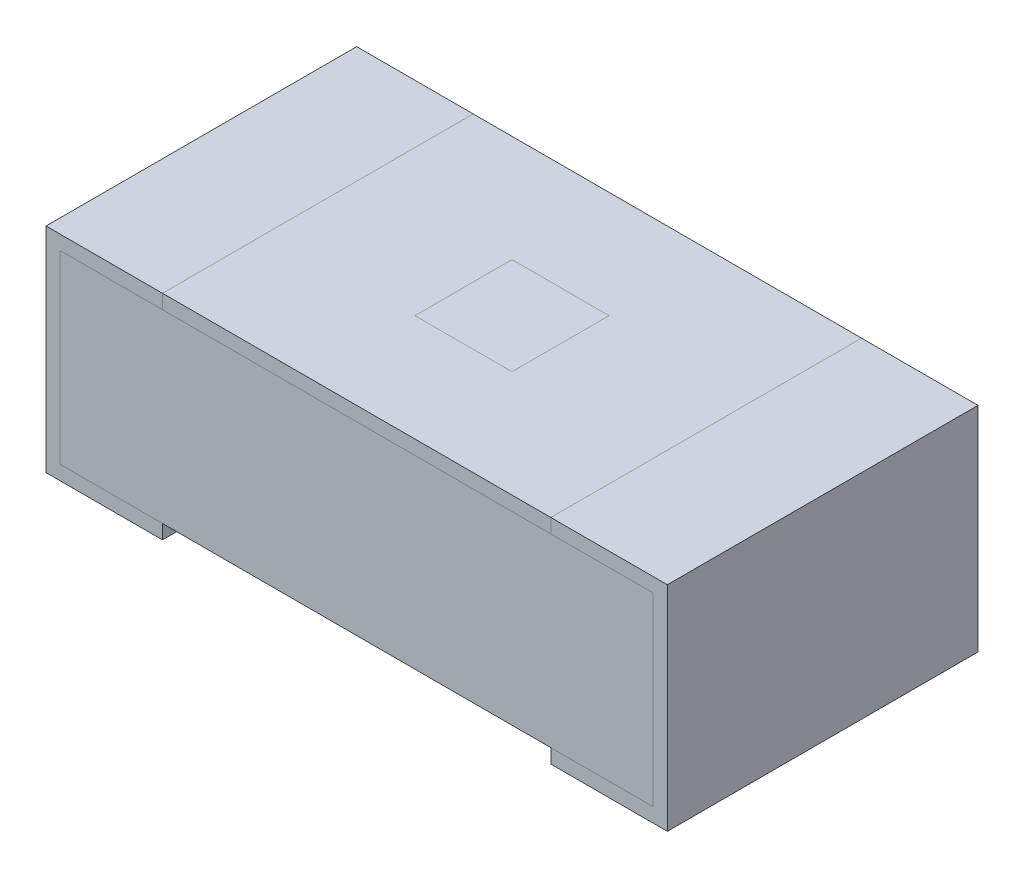
ISO-10303-21;
HEADER;
FILE_DESCRIPTION(('STEP AP214'),'2;1');
FILE_NAME('part.step','',(''),(''),'','','');
FILE_SCHEMA(('AUTOMOTIVE_DESIGN { 1 0 10303 214 1 1 1 1 }'));
ENDSEC;
DATA;
#1=APPLICATION_CONTEXT('core data for automotive mechanical design processes');
#2=APPLICATION_PROTOCOL_DEFINITION('international standard','automotive_design',2000,#1);
#3=PRODUCT_CONTEXT('',#1,'mechanical');
#4=PRODUCT('Part','Part','',(#3));
#5=PRODUCT_RELATED_PRODUCT_CATEGORY('part','',(#4));
#6=PRODUCT_DEFINITION_FORMATION('','',#4);
#7=PRODUCT_DEFINITION_CONTEXT('part definition',#1,'design');
#8=PRODUCT_DEFINITION('design','',#6,#7);
#9=PRODUCT_DEFINITION_SHAPE('','',#8);
#10=(LENGTH_UNIT() NAMED_UNIT(*) SI_UNIT(.MILLI.,.METRE.));
#11=(NAMED_UNIT(*) PLANE_ANGLE_UNIT() SI_UNIT($,.RADIAN.));
#12=(NAMED_UNIT(*) SI_UNIT($,.STERADIAN.) SOLID_ANGLE_UNIT());
#13=UNCERTAINTY_MEASURE_WITH_UNIT(LENGTH_MEASURE(1.E-05),#10,'distance_accuracy_value','');
#14=(GEOMETRIC_REPRESENTATION_CONTEXT(3) GLOBAL_UNCERTAINTY_ASSIGNED_CONTEXT((#13)) GLOBAL_UNIT_ASSIGNED_CONTEXT((#10,
#11,#12)) REPRESENTATION_CONTEXT('',''));
#15=CARTESIAN_POINT('',(0.,0.,0.));
#16=DIRECTION('',(0.,0.,1.));
#17=DIRECTION('',(1.,0.,0.));
#18=AXIS2_PLACEMENT_3D('',#15,#16,#17);
#19=CARTESIAN_POINT('',(-0.8,0.55,0.4));
#20=DIRECTION('',(0.,0.,-1.));
#21=DIRECTION('',(0.,-1.,0.));
#22=AXIS2_PLACEMENT_3D('',#19,#20,#21);
#23=PLANE('',#22);
#24=DIRECTION('',(1.,0.,0.));
#25=VECTOR('',#24,1.);
#26=CARTESIAN_POINT('',(-0.8,0.03666666666667,0.4));
#27=LINE('',#26,#25);
#28=CARTESIAN_POINT('',(-0.763333333333,0.03666666666667,0.4));
#29=VERTEX_POINT('',#28);
#30=CARTESIAN_POINT('',(0.763333333333,0.03666666666667,0.4));
#31=VERTEX_POINT('',#30);
#32=EDGE_CURVE('P0_E99',#29,#31,#27,.T.);
#33=ORIENTED_EDGE('',*,*,#32,.T.);
#34=DIRECTION('',(0.,1.,0.));
#35=VECTOR('',#34,1.);
#36=CARTESIAN_POINT('',(0.763333333333,0.55,0.4));
#37=LINE('',#36,#35);
#38=CARTESIAN_POINT('',(0.763333333333,0.513333333333,0.4));
#39=VERTEX_POINT('',#38);
#40=EDGE_CURVE('P0_E11',#31,#39,#37,.T.);
#41=ORIENTED_EDGE('',*,*,#40,.T.);
#42=DIRECTION('',(-1.,0.,0.));
#43=VECTOR('',#42,1.);
#44=CARTESIAN_POINT('',(-0.8,0.513333333333,0.4));
#45=LINE('',#44,#43);
#46=CARTESIAN_POINT('',(-0.763333333333,0.513333333333,0.4));
#47=VERTEX_POINT('',#46);
#48=EDGE_CURVE('P0_E20',#39,#47,#45,.T.);
#49=ORIENTED_EDGE('',*,*,#48,.T.);
#50=DIRECTION('',(0.,-1.,0.));
#51=VECTOR('',#50,1.);
#52=CARTESIAN_POINT('',(-0.763333333333,0.55,0.4));
#53=LINE('',#52,#51);
#54=EDGE_CURVE('P0_E77',#47,#29,#53,.T.);
#55=ORIENTED_EDGE('',*,*,#54,.T.);
#56=EDGE_LOOP('',(#33,#41,#49,#55));
#57=FACE_BOUND('',#56,.T.);
#58=ADVANCED_FACE('P0_F17',(#57),#23,.F.);
#59=CARTESIAN_POINT('',(-0.8,0.55,-0.4));
#60=DIRECTION('',(0.,0.,1.));
#61=DIRECTION('',(1.,0.,0.));
#62=AXIS2_PLACEMENT_3D('',#59,#60,#61);
#63=PLANE('',#62);
#64=DIRECTION('',(0.,-1.,0.));
#65=VECTOR('',#64,1.);
#66=CARTESIAN_POINT('',(0.763333333333,0.55,-0.4));
#67=LINE('',#66,#65);
#68=CARTESIAN_POINT('',(0.763333333333,0.513333333333,-0.4));
#69=VERTEX_POINT('',#68);
#70=CARTESIAN_POINT('',(0.763333333333,0.03666666666667,-0.4));
#71=VERTEX_POINT('',#70);
#72=EDGE_CURVE('P0_E27',#69,#71,#67,.T.);
#73=ORIENTED_EDGE('',*,*,#72,.T.);
#74=DIRECTION('',(-1.,0.,0.));
#75=VECTOR('',#74,1.);
#76=CARTESIAN_POINT('',(-0.8,0.03666666666667,-0.4));
#77=LINE('',#76,#75);
#78=CARTESIAN_POINT('',(-0.763333333333,0.03666666666667,-0.4));
#79=VERTEX_POINT('',#78);
#80=EDGE_CURVE('P0_E108',#71,#79,#77,.T.);
#81=ORIENTED_EDGE('',*,*,#80,.T.);
#82=DIRECTION('',(0.,1.,0.));
#83=VECTOR('',#82,1.);
#84=CARTESIAN_POINT('',(-0.763333333333,0.55,-0.4));
#85=LINE('',#84,#83);
#86=CARTESIAN_POINT('',(-0.763333333333,0.513333333333,-0.4));
#87=VERTEX_POINT('',#86);
#88=EDGE_CURVE('P0_E85',#79,#87,#85,.T.);
#89=ORIENTED_EDGE('',*,*,#88,.T.);
#90=DIRECTION('',(1.,0.,0.));
#91=VECTOR('',#90,1.);
#92=CARTESIAN_POINT('',(-0.8,0.513333333333,-0.4));
#93=LINE('',#92,#91);
#94=EDGE_CURVE('P0_E83',#87,#69,#93,.T.);
#95=ORIENTED_EDGE('',*,*,#94,.T.);
#96=EDGE_LOOP('',(#73,#81,#89,#95));
#97=FACE_BOUND('',#96,.T.);
#98=ADVANCED_FACE('P0_F87',(#97),#63,.F.);
#99=CARTESIAN_POINT('',(0.763333333333,0.513333333333,0.4));
#100=DIRECTION('',(-1.,0.,0.));
#101=DIRECTION('',(0.,0.,1.));
#102=AXIS2_PLACEMENT_3D('',#99,#100,#101);
#103=PLANE('',#102);
#104=ORIENTED_EDGE('',*,*,#72,.F.);
#105=DIRECTION('',(0.,0.,-1.));
#106=VECTOR('',#105,1.);
#107=CARTESIAN_POINT('',(0.763333333333,0.513333333333,0.4));
#108=LINE('',#107,#106);
#109=EDGE_CURVE('P0_E68',#39,#69,#108,.T.);
#110=ORIENTED_EDGE('',*,*,#109,.F.);
#111=ORIENTED_EDGE('',*,*,#40,.F.);
#112=DIRECTION('',(0.,0.,-1.));
#113=VECTOR('',#112,1.);
#114=CARTESIAN_POINT('',(0.763333333333,0.03666666666667,0.4));
#115=LINE('',#114,#113);
#116=EDGE_CURVE('P0_E71',#31,#71,#115,.T.);
#117=ORIENTED_EDGE('',*,*,#116,.T.);
#118=EDGE_LOOP('',(#104,#110,#111,#117));
#119=FACE_BOUND('',#118,.T.);
#120=ADVANCED_FACE('P0_F67',(#119),#103,.F.);
#121=CARTESIAN_POINT('',(-0.763333333333,0.513333333333,0.4));
#122=DIRECTION('',(1.,0.,0.));
#123=DIRECTION('',(0.,1.,0.));
#124=AXIS2_PLACEMENT_3D('',#121,#122,#123);
#125=PLANE('',#124);
#126=ORIENTED_EDGE('',*,*,#88,.F.);
#127=DIRECTION('',(0.,0.,-1.));
#128=VECTOR('',#127,1.);
#129=CARTESIAN_POINT('',(-0.763333333333,0.03666666666667,0.4));
#130=LINE('',#129,#128);
#131=EDGE_CURVE('P0_E91',#29,#79,#130,.T.);
#132=ORIENTED_EDGE('',*,*,#131,.F.);
#133=ORIENTED_EDGE('',*,*,#54,.F.);
#134=DIRECTION('',(0.,0.,-1.));
#135=VECTOR('',#134,1.);
#136=CARTESIAN_POINT('',(-0.763333333333,0.513333333333,0.4));
#137=LINE('',#136,#135);
#138=EDGE_CURVE('P0_E90',#47,#87,#137,.T.);
#139=ORIENTED_EDGE('',*,*,#138,.T.);
#140=EDGE_LOOP('',(#126,#132,#133,#139));
#141=FACE_BOUND('',#140,.T.);
#142=ADVANCED_FACE('P0_F146',(#141),#125,.F.);
#143=CARTESIAN_POINT('',(0.763333333333,0.513333333333,0.4));
#144=DIRECTION('',(0.,-1.,0.));
#145=DIRECTION('',(0.,0.,-1.));
#146=AXIS2_PLACEMENT_3D('',#143,#144,#145);
#147=PLANE('',#146);
#148=ORIENTED_EDGE('',*,*,#94,.F.);
#149=ORIENTED_EDGE('',*,*,#138,.F.);
#150=ORIENTED_EDGE('',*,*,#48,.F.);
#151=ORIENTED_EDGE('',*,*,#109,.T.);
#152=EDGE_LOOP('',(#148,#149,#150,#151));
#153=FACE_BOUND('',#152,.T.);
#154=ADVANCED_FACE('P0_F81',(#153),#147,.F.);
#155=CARTESIAN_POINT('',(-0.763333333333,0.03666666666667,0.4));
#156=DIRECTION('',(0.,1.,0.));
#157=DIRECTION('',(1.,0.,0.));
#158=AXIS2_PLACEMENT_3D('',#155,#156,#157);
#159=PLANE('',#158);
#160=ORIENTED_EDGE('',*,*,#80,.F.);
#161=ORIENTED_EDGE('',*,*,#116,.F.);
#162=ORIENTED_EDGE('',*,*,#32,.F.);
#163=ORIENTED_EDGE('',*,*,#131,.T.);
#164=EDGE_LOOP('',(#160,#161,#162,#163));
#165=FACE_BOUND('',#164,.T.);
#166=ADVANCED_FACE('P0_F145',(#165),#159,.F.);
#167=CLOSED_SHELL('',(#58,#98,#120,#142,#154,#166));
#168=MANIFOLD_SOLID_BREP('P0_B1',#167);
#169=CARTESIAN_POINT('',(0.8,0.55,0.4));
#170=DIRECTION('',(-1.,0.,0.));
#171=DIRECTION('',(0.,0.,1.));
#172=AXIS2_PLACEMENT_3D('',#169,#170,#171);
#173=PLANE('',#172);
#174=DIRECTION('',(0.,0.,-1.));
#175=VECTOR('',#174,1.);
#176=CARTESIAN_POINT('',(0.8,0.,0.4));
#177=LINE('',#176,#175);
#178=CARTESIAN_POINT('',(0.8,0.,0.4));
#179=VERTEX_POINT('',#178);
#180=CARTESIAN_POINT('',(0.8,0.,-0.4));
#181=VERTEX_POINT('',#180);
#182=EDGE_CURVE('P1_E101',#179,#181,#177,.T.);
#183=ORIENTED_EDGE('',*,*,#182,.T.);
#184=DIRECTION('',(0.,-1.,0.));
#185=VECTOR('',#184,1.);
#186=CARTESIAN_POINT('',(0.8,0.55,-0.4));
#187=LINE('',#186,#185);
#188=CARTESIAN_POINT('',(0.8,0.55,-0.4));
#189=VERTEX_POINT('',#188);
#190=EDGE_CURVE('P1_E11',#189,#181,#187,.T.);
#191=ORIENTED_EDGE('',*,*,#190,.F.);
#192=DIRECTION('',(0.,0.,-1.));
#193=VECTOR('',#192,1.);
#194=CARTESIAN_POINT('',(0.8,0.55,0.4));
#195=LINE('',#194,#193);
#196=CARTESIAN_POINT('',(0.8,0.55,0.4));
#197=VERTEX_POINT('',#196);
#198=EDGE_CURVE('P1_E104',#197,#189,#195,.T.);
#199=ORIENTED_EDGE('',*,*,#198,.F.);
#200=DIRECTION('',(0.,-1.,0.));
#201=VECTOR('',#200,1.);
#202=CARTESIAN_POINT('',(0.8,0.55,0.4));
#203=LINE('',#202,#201);
#204=EDGE_CURVE('P1_E26',#197,#179,#203,.T.);
#205=ORIENTED_EDGE('',*,*,#204,.T.);
#206=EDGE_LOOP('',(#183,#191,#199,#205));
#207=FACE_BOUND('',#206,.T.);
#208=ADVANCED_FACE('P1_F16',(#207),#173,.F.);
#209=CARTESIAN_POINT('',(-0.8,0.55,-0.4));
#210=DIRECTION('',(0.,0.,1.));
#211=DIRECTION('',(1.,0.,0.));
#212=AXIS2_PLACEMENT_3D('',#209,#210,#211);
#213=PLANE('',#212);
#214=DIRECTION('',(1.,0.,0.));
#215=VECTOR('',#214,1.);
#216=CARTESIAN_POINT('',(-0.8,0.513333333333,-0.4));
#217=LINE('',#216,#215);
#218=CARTESIAN_POINT('',(0.5,0.513333333333,-0.4));
#219=VERTEX_POINT('',#218);
#220=CARTESIAN_POINT('',(0.763333333333,0.513333333333,-0.4));
#221=VERTEX_POINT('',#220);
#222=EDGE_CURVE('P1_E141',#219,#221,#217,.T.);
#223=ORIENTED_EDGE('',*,*,#222,.F.);
#224=DIRECTION('',(0.,1.,0.));
#225=VECTOR('',#224,1.);
#226=CARTESIAN_POINT('',(0.5,0.55,-0.4));
#227=LINE('',#226,#225);
#228=CARTESIAN_POINT('',(0.5,0.55,-0.4));
#229=VERTEX_POINT('',#228);
#230=EDGE_CURVE('P1_E138',#219,#229,#227,.T.);
#231=ORIENTED_EDGE('',*,*,#230,.T.);
#232=DIRECTION('',(-1.,0.,0.));
#233=VECTOR('',#232,1.);
#234=CARTESIAN_POINT('',(-0.8,0.55,-0.4));
#235=LINE('',#234,#233);
#236=EDGE_CURVE('P1_E113',#189,#229,#235,.T.);
#237=ORIENTED_EDGE('',*,*,#236,.F.);
#238=ORIENTED_EDGE('',*,*,#190,.T.);
#239=DIRECTION('',(-1.,0.,0.));
#240=VECTOR('',#239,1.);
#241=CARTESIAN_POINT('',(-0.8,0.,-0.4));
#242=LINE('',#241,#240);
#243=CARTESIAN_POINT('',(0.5,0.,-0.4));
#244=VERTEX_POINT('',#243);
#245=EDGE_CURVE('P1_E133',#181,#244,#242,.T.);
#246=ORIENTED_EDGE('',*,*,#245,.T.);
#247=DIRECTION('',(0.,-1.,0.));
#248=VECTOR('',#247,1.);
#249=CARTESIAN_POINT('',(0.5,0.55,-0.4));
#250=LINE('',#249,#248);
#251=CARTESIAN_POINT('',(0.5,0.03666666666667,-0.4));
#252=VERTEX_POINT('',#251);
#253=EDGE_CURVE('P1_E147',#252,#244,#250,.T.);
#254=ORIENTED_EDGE('',*,*,#253,.F.);
#255=DIRECTION('',(-1.,0.,0.));
#256=VECTOR('',#255,1.);
#257=CARTESIAN_POINT('',(-0.8,0.03666666666667,-0.4));
#258=LINE('',#257,#256);
#259=CARTESIAN_POINT('',(0.763333333333,0.03666666666667,-0.4));
#260=VERTEX_POINT('',#259);
#261=EDGE_CURVE('P1_E156',#260,#252,#258,.T.);
#262=ORIENTED_EDGE('',*,*,#261,.F.);
#263=DIRECTION('',(0.,-1.,0.));
#264=VECTOR('',#263,1.);
#265=CARTESIAN_POINT('',(0.763333333333,0.55,-0.4));
#266=LINE('',#265,#264);
#267=EDGE_CURVE('P1_E173',#221,#260,#266,.T.);
#268=ORIENTED_EDGE('',*,*,#267,.F.);
#269=EDGE_LOOP('',(#223,#231,#237,#238,#246,#254,#262,#268));
#270=FACE_BOUND('',#269,.T.);
#271=ADVANCED_FACE('P1_F192',(#270),#213,.F.);
#272=CARTESIAN_POINT('',(-0.8,0.55,0.4));
#273=DIRECTION('',(0.,0.,-1.));
#274=DIRECTION('',(0.,-1.,0.));
#275=AXIS2_PLACEMENT_3D('',#272,#273,#274);
#276=PLANE('',#275);
#277=DIRECTION('',(-1.,0.,0.));
#278=VECTOR('',#277,1.);
#279=CARTESIAN_POINT('',(-0.8,0.513333333333,0.4));
#280=LINE('',#279,#278);
#281=CARTESIAN_POINT('',(0.763333333333,0.513333333333,0.4));
#282=VERTEX_POINT('',#281);
#283=CARTESIAN_POINT('',(0.5,0.513333333333,0.4));
#284=VERTEX_POINT('',#283);
#285=EDGE_CURVE('P1_E119',#282,#284,#280,.T.);
#286=ORIENTED_EDGE('',*,*,#285,.F.);
#287=DIRECTION('',(0.,1.,0.));
#288=VECTOR('',#287,1.);
#289=CARTESIAN_POINT('',(0.763333333333,0.55,0.4));
#290=LINE('',#289,#288);
#291=CARTESIAN_POINT('',(0.763333333333,0.03666666666667,0.4));
#292=VERTEX_POINT('',#291);
#293=EDGE_CURVE('P1_E19',#292,#282,#290,.T.);
#294=ORIENTED_EDGE('',*,*,#293,.F.);
#295=DIRECTION('',(1.,0.,0.));
#296=VECTOR('',#295,1.);
#297=CARTESIAN_POINT('',(-0.8,0.03666666666667,0.4));
#298=LINE('',#297,#296);
#299=CARTESIAN_POINT('',(0.5,0.03666666666667,0.4));
#300=VERTEX_POINT('',#299);
#301=EDGE_CURVE('P1_E125',#300,#292,#298,.T.);
#302=ORIENTED_EDGE('',*,*,#301,.F.);
#303=DIRECTION('',(0.,1.,0.));
#304=VECTOR('',#303,1.);
#305=CARTESIAN_POINT('',(0.5,0.55,0.4));
#306=LINE('',#305,#304);
#307=CARTESIAN_POINT('',(0.5,0.,0.4));
#308=VERTEX_POINT('',#307);
#309=EDGE_CURVE('P1_E146',#308,#300,#306,.T.);
#310=ORIENTED_EDGE('',*,*,#309,.F.);
#311=DIRECTION('',(1.,0.,0.));
#312=VECTOR('',#311,1.);
#313=CARTESIAN_POINT('',(-0.8,0.,0.4));
#314=LINE('',#313,#312);
#315=EDGE_CURVE('P1_E97',#308,#179,#314,.T.);
#316=ORIENTED_EDGE('',*,*,#315,.T.);
#317=ORIENTED_EDGE('',*,*,#204,.F.);
#318=DIRECTION('',(1.,0.,0.));
#319=VECTOR('',#318,1.);
#320=CARTESIAN_POINT('',(-0.8,0.55,0.4));
#321=LINE('',#320,#319);
#322=CARTESIAN_POINT('',(0.5,0.55,0.4));
#323=VERTEX_POINT('',#322);
#324=EDGE_CURVE('P1_E94',#323,#197,#321,.T.);
#325=ORIENTED_EDGE('',*,*,#324,.F.);
#326=DIRECTION('',(0.,-1.,0.));
#327=VECTOR('',#326,1.);
#328=CARTESIAN_POINT('',(0.5,0.55,0.4));
#329=LINE('',#328,#327);
#330=EDGE_CURVE('P1_E123',#323,#284,#329,.T.);
#331=ORIENTED_EDGE('',*,*,#330,.T.);
#332=EDGE_LOOP('',(#286,#294,#302,#310,#316,#317,#325,#331));
#333=FACE_BOUND('',#332,.T.);
#334=ADVANCED_FACE('P1_F91',(#333),#276,.F.);
#335=CARTESIAN_POINT('',(0.,0.,0.));
#336=DIRECTION('',(0.,-1.,0.));
#337=DIRECTION('',(0.,0.,-1.));
#338=AXIS2_PLACEMENT_3D('',#335,#336,#337);
#339=PLANE('',#338);
#340=ORIENTED_EDGE('',*,*,#315,.F.);
#341=DIRECTION('',(0.,0.,-1.));
#342=VECTOR('',#341,1.);
#343=CARTESIAN_POINT('',(0.5,0.,0.));
#344=LINE('',#343,#342);
#345=EDGE_CURVE('P1_E151',#308,#244,#344,.T.);
#346=ORIENTED_EDGE('',*,*,#345,.T.);
#347=ORIENTED_EDGE('',*,*,#245,.F.);
#348=ORIENTED_EDGE('',*,*,#182,.F.);
#349=EDGE_LOOP('',(#340,#346,#347,#348));
#350=FACE_BOUND('',#349,.T.);
#351=ADVANCED_FACE('P1_F211',(#350),#339,.T.);
#352=CARTESIAN_POINT('',(0.,0.55,0.));
#353=DIRECTION('',(0.,-1.,0.));
#354=DIRECTION('',(0.,0.,-1.));
#355=AXIS2_PLACEMENT_3D('',#352,#353,#354);
#356=PLANE('',#355);
#357=ORIENTED_EDGE('',*,*,#236,.T.);
#358=DIRECTION('',(0.,0.,1.));
#359=VECTOR('',#358,1.);
#360=CARTESIAN_POINT('',(0.5,0.55,0.));
#361=LINE('',#360,#359);
#362=EDGE_CURVE('P1_E110',#229,#323,#361,.T.);
#363=ORIENTED_EDGE('',*,*,#362,.T.);
#364=ORIENTED_EDGE('',*,*,#324,.T.);
#365=ORIENTED_EDGE('',*,*,#198,.T.);
#366=EDGE_LOOP('',(#357,#363,#364,#365));
#367=FACE_BOUND('',#366,.T.);
#368=ADVANCED_FACE('P1_F108',(#367),#356,.F.);
#369=CARTESIAN_POINT('',(0.763333333333,0.513333333333,0.4));
#370=DIRECTION('',(0.,-1.,0.));
#371=DIRECTION('',(0.,0.,-1.));
#372=AXIS2_PLACEMENT_3D('',#369,#370,#371);
#373=PLANE('',#372);
#374=DIRECTION('',(0.,0.,1.));
#375=VECTOR('',#374,1.);
#376=CARTESIAN_POINT('',(0.5,0.513333333333,0.4));
#377=LINE('',#376,#375);
#378=EDGE_CURVE('P1_E134',#219,#284,#377,.T.);
#379=ORIENTED_EDGE('',*,*,#378,.F.);
#380=ORIENTED_EDGE('',*,*,#222,.T.);
#381=DIRECTION('',(0.,0.,-1.));
#382=VECTOR('',#381,1.);
#383=CARTESIAN_POINT('',(0.763333333333,0.513333333333,0.4));
#384=LINE('',#383,#382);
#385=EDGE_CURVE('P1_E152',#282,#221,#384,.T.);
#386=ORIENTED_EDGE('',*,*,#385,.F.);
#387=ORIENTED_EDGE('',*,*,#285,.T.);
#388=EDGE_LOOP('',(#379,#380,#386,#387));
#389=FACE_BOUND('',#388,.T.);
#390=ADVANCED_FACE('P1_F189',(#389),#373,.T.);
#391=CARTESIAN_POINT('',(0.5,0.,0.4));
#392=DIRECTION('',(-1.,0.,0.));
#393=DIRECTION('',(0.,0.,1.));
#394=AXIS2_PLACEMENT_3D('',#391,#392,#393);
#395=PLANE('',#394);
#396=ORIENTED_EDGE('',*,*,#253,.T.);
#397=ORIENTED_EDGE('',*,*,#345,.F.);
#398=ORIENTED_EDGE('',*,*,#309,.T.);
#399=DIRECTION('',(0.,0.,1.));
#400=VECTOR('',#399,1.);
#401=CARTESIAN_POINT('',(0.5,0.03666666666667,0.4));
#402=LINE('',#401,#400);
#403=EDGE_CURVE('P1_E130',#252,#300,#402,.T.);
#404=ORIENTED_EDGE('',*,*,#403,.F.);
#405=EDGE_LOOP('',(#396,#397,#398,#404));
#406=FACE_BOUND('',#405,.T.);
#407=ADVANCED_FACE('P1_F198',(#406),#395,.T.);
#408=CARTESIAN_POINT('',(0.763333333333,0.513333333333,0.4));
#409=DIRECTION('',(-1.,0.,0.));
#410=DIRECTION('',(0.,0.,1.));
#411=AXIS2_PLACEMENT_3D('',#408,#409,#410);
#412=PLANE('',#411);
#413=ORIENTED_EDGE('',*,*,#267,.T.);
#414=DIRECTION('',(0.,0.,-1.));
#415=VECTOR('',#414,1.);
#416=CARTESIAN_POINT('',(0.763333333333,0.03666666666667,0.4));
#417=LINE('',#416,#415);
#418=EDGE_CURVE('P1_E129',#292,#260,#417,.T.);
#419=ORIENTED_EDGE('',*,*,#418,.F.);
#420=ORIENTED_EDGE('',*,*,#293,.T.);
#421=ORIENTED_EDGE('',*,*,#385,.T.);
#422=EDGE_LOOP('',(#413,#419,#420,#421));
#423=FACE_BOUND('',#422,.T.);
#424=ADVANCED_FACE('P1_F184',(#423),#412,.T.);
#425=CARTESIAN_POINT('',(-0.763333333333,0.03666666666667,0.4));
#426=DIRECTION('',(0.,1.,0.));
#427=DIRECTION('',(1.,0.,0.));
#428=AXIS2_PLACEMENT_3D('',#425,#426,#427);
#429=PLANE('',#428);
#430=ORIENTED_EDGE('',*,*,#261,.T.);
#431=ORIENTED_EDGE('',*,*,#403,.T.);
#432=ORIENTED_EDGE('',*,*,#301,.T.);
#433=ORIENTED_EDGE('',*,*,#418,.T.);
#434=EDGE_LOOP('',(#430,#431,#432,#433));
#435=FACE_BOUND('',#434,.T.);
#436=ADVANCED_FACE('P1_F196',(#435),#429,.T.);
#437=CARTESIAN_POINT('',(0.5,0.55,0.4));
#438=DIRECTION('',(1.,0.,0.));
#439=DIRECTION('',(0.,1.,0.));
#440=AXIS2_PLACEMENT_3D('',#437,#438,#439);
#441=PLANE('',#440);
#442=ORIENTED_EDGE('',*,*,#230,.F.);
#443=ORIENTED_EDGE('',*,*,#378,.T.);
#444=ORIENTED_EDGE('',*,*,#330,.F.);
#445=ORIENTED_EDGE('',*,*,#362,.F.);
#446=EDGE_LOOP('',(#442,#443,#444,#445));
#447=FACE_BOUND('',#446,.T.);
#448=ADVANCED_FACE('P1_F230',(#447),#441,.F.);
#449=CLOSED_SHELL('',(#208,#271,#334,#351,#368,#390,#407,#424,#436,#448));
#450=MANIFOLD_SOLID_BREP('P1_B1',#449);
#451=CARTESIAN_POINT('',(-0.763333333333,0.03666666666667,0.4));
#452=DIRECTION('',(0.,1.,0.));
#453=DIRECTION('',(1.,0.,0.));
#454=AXIS2_PLACEMENT_3D('',#451,#452,#453);
#455=PLANE('',#454);
#456=DIRECTION('',(0.,0.,1.));
#457=VECTOR('',#456,1.);
#458=CARTESIAN_POINT('',(-0.5,0.03666666666667,0.4));
#459=LINE('',#458,#457);
#460=CARTESIAN_POINT('',(-0.5,0.03666666666667,-0.4));
#461=VERTEX_POINT('',#460);
#462=CARTESIAN_POINT('',(-0.5,0.03666666666667,0.4));
#463=VERTEX_POINT('',#462);
#464=EDGE_CURVE('P2_E139',#461,#463,#459,.T.);
#465=ORIENTED_EDGE('',*,*,#464,.F.);
#466=DIRECTION('',(-1.,0.,0.));
#467=VECTOR('',#466,1.);
#468=CARTESIAN_POINT('',(-0.8,0.03666666666667,-0.4));
#469=LINE('',#468,#467);
#470=CARTESIAN_POINT('',(-0.763333333333,0.03666666666667,-0.4));
#471=VERTEX_POINT('',#470);
#472=EDGE_CURVE('P2_E118',#461,#471,#469,.T.);
#473=ORIENTED_EDGE('',*,*,#472,.T.);
#474=DIRECTION('',(0.,0.,-1.));
#475=VECTOR('',#474,1.);
#476=CARTESIAN_POINT('',(-0.763333333333,0.03666666666667,0.4));
#477=LINE('',#476,#475);
#478=CARTESIAN_POINT('',(-0.763333333333,0.03666666666667,0.4));
#479=VERTEX_POINT('',#478);
#480=EDGE_CURVE('P2_E11',#479,#471,#477,.T.);
#481=ORIENTED_EDGE('',*,*,#480,.F.);
#482=DIRECTION('',(1.,0.,0.));
#483=VECTOR('',#482,1.);
#484=CARTESIAN_POINT('',(-0.8,0.03666666666667,0.4));
#485=LINE('',#484,#483);
#486=EDGE_CURVE('P2_E144',#479,#463,#485,.T.);
#487=ORIENTED_EDGE('',*,*,#486,.T.);
#488=EDGE_LOOP('',(#465,#473,#481,#487));
#489=FACE_BOUND('',#488,.T.);
#490=ADVANCED_FACE('P2_F16',(#489),#455,.T.);
#491=CARTESIAN_POINT('',(-0.763333333333,0.513333333333,0.4));
#492=DIRECTION('',(1.,0.,0.));
#493=DIRECTION('',(0.,1.,0.));
#494=AXIS2_PLACEMENT_3D('',#491,#492,#493);
#495=PLANE('',#494);
#496=DIRECTION('',(0.,1.,0.));
#497=VECTOR('',#496,1.);
#498=CARTESIAN_POINT('',(-0.763333333333,0.55,-0.4));
#499=LINE('',#498,#497);
#500=CARTESIAN_POINT('',(-0.763333333333,0.513333333333,-0.4));
#501=VERTEX_POINT('',#500);
#502=EDGE_CURVE('P2_E125',#471,#501,#499,.T.);
#503=ORIENTED_EDGE('',*,*,#502,.T.);
#504=DIRECTION('',(0.,0.,-1.));
#505=VECTOR('',#504,1.);
#506=CARTESIAN_POINT('',(-0.763333333333,0.513333333333,0.4));
#507=LINE('',#506,#505);
#508=CARTESIAN_POINT('',(-0.763333333333,0.513333333333,0.4));
#509=VERTEX_POINT('',#508);
#510=EDGE_CURVE('P2_E27',#509,#501,#507,.T.);
#511=ORIENTED_EDGE('',*,*,#510,.F.);
#512=DIRECTION('',(0.,-1.,0.));
#513=VECTOR('',#512,1.);
#514=CARTESIAN_POINT('',(-0.763333333333,0.55,0.4));
#515=LINE('',#514,#513);
#516=EDGE_CURVE('P2_E140',#509,#479,#515,.T.);
#517=ORIENTED_EDGE('',*,*,#516,.T.);
#518=ORIENTED_EDGE('',*,*,#480,.T.);
#519=EDGE_LOOP('',(#503,#511,#517,#518));
#520=FACE_BOUND('',#519,.T.);
#521=ADVANCED_FACE('P2_F224',(#520),#495,.T.);
#522=CARTESIAN_POINT('',(0.763333333333,0.513333333333,0.4));
#523=DIRECTION('',(0.,-1.,0.));
#524=DIRECTION('',(0.,0.,-1.));
#525=AXIS2_PLACEMENT_3D('',#522,#523,#524);
#526=PLANE('',#525);
#527=DIRECTION('',(1.,0.,0.));
#528=VECTOR('',#527,1.);
#529=CARTESIAN_POINT('',(-0.8,0.513333333333,-0.4));
#530=LINE('',#529,#528);
#531=CARTESIAN_POINT('',(-0.5,0.513333333333,-0.4));
#532=VERTEX_POINT('',#531);
#533=EDGE_CURVE('P2_E150',#501,#532,#530,.T.);
#534=ORIENTED_EDGE('',*,*,#533,.T.);
#535=DIRECTION('',(0.,0.,1.));
#536=VECTOR('',#535,1.);
#537=CARTESIAN_POINT('',(-0.5,0.513333333333,0.4));
#538=LINE('',#537,#536);
#539=CARTESIAN_POINT('',(-0.5,0.513333333333,0.4));
#540=VERTEX_POINT('',#539);
#541=EDGE_CURVE('P2_E147',#532,#540,#538,.T.);
#542=ORIENTED_EDGE('',*,*,#541,.T.);
#543=DIRECTION('',(-1.,0.,0.));
#544=VECTOR('',#543,1.);
#545=CARTESIAN_POINT('',(-0.8,0.513333333333,0.4));
#546=LINE('',#545,#544);
#547=EDGE_CURVE('P2_E143',#540,#509,#546,.T.);
#548=ORIENTED_EDGE('',*,*,#547,.T.);
#549=ORIENTED_EDGE('',*,*,#510,.T.);
#550=EDGE_LOOP('',(#534,#542,#548,#549));
#551=FACE_BOUND('',#550,.T.);
#552=ADVANCED_FACE('P2_F236',(#551),#526,.T.);
#553=CARTESIAN_POINT('',(-0.5,0.55,0.4));
#554=DIRECTION('',(1.,0.,0.));
#555=DIRECTION('',(0.,1.,0.));
#556=AXIS2_PLACEMENT_3D('',#553,#554,#555);
#557=PLANE('',#556);
#558=DIRECTION('',(0.,1.,0.));
#559=VECTOR('',#558,1.);
#560=CARTESIAN_POINT('',(-0.5,0.55,-0.4));
#561=LINE('',#560,#559);
#562=CARTESIAN_POINT('',(-0.5,0.55,-0.4));
#563=VERTEX_POINT('',#562);
#564=EDGE_CURVE('P2_E20',#532,#563,#561,.T.);
#565=ORIENTED_EDGE('',*,*,#564,.T.);
#566=DIRECTION('',(0.,0.,1.));
#567=VECTOR('',#566,1.);
#568=CARTESIAN_POINT('',(-0.5,0.55,0.));
#569=LINE('',#568,#567);
#570=CARTESIAN_POINT('',(-0.5,0.55,0.4));
#571=VERTEX_POINT('',#570);
#572=EDGE_CURVE('P2_E174',#563,#571,#569,.T.);
#573=ORIENTED_EDGE('',*,*,#572,.T.);
#574=DIRECTION('',(0.,-1.,0.));
#575=VECTOR('',#574,1.);
#576=CARTESIAN_POINT('',(-0.5,0.55,0.4));
#577=LINE('',#576,#575);
#578=EDGE_CURVE('P2_E129',#571,#540,#577,.T.);
#579=ORIENTED_EDGE('',*,*,#578,.T.);
#580=ORIENTED_EDGE('',*,*,#541,.F.);
#581=EDGE_LOOP('',(#565,#573,#579,#580));
#582=FACE_BOUND('',#581,.T.);
#583=ADVANCED_FACE('P2_F230',(#582),#557,.T.);
#584=CARTESIAN_POINT('',(0.,0.55,0.));
#585=DIRECTION('',(0.,-1.,0.));
#586=DIRECTION('',(0.,0.,-1.));
#587=AXIS2_PLACEMENT_3D('',#584,#585,#586);
#588=PLANE('',#587);
#589=ORIENTED_EDGE('',*,*,#572,.F.);
#590=DIRECTION('',(-1.,0.,0.));
#591=VECTOR('',#590,1.);
#592=CARTESIAN_POINT('',(-0.8,0.55,-0.4));
#593=LINE('',#592,#591);
#594=CARTESIAN_POINT('',(-0.8,0.55,-0.4));
#595=VERTEX_POINT('',#594);
#596=EDGE_CURVE('P2_E102',#563,#595,#593,.T.);
#597=ORIENTED_EDGE('',*,*,#596,.T.);
#598=DIRECTION('',(0.,0.,1.));
#599=VECTOR('',#598,1.);
#600=CARTESIAN_POINT('',(-0.8,0.55,0.4));
#601=LINE('',#600,#599);
#602=CARTESIAN_POINT('',(-0.8,0.55,0.4));
#603=VERTEX_POINT('',#602);
#604=EDGE_CURVE('P2_E107',#595,#603,#601,.T.);
#605=ORIENTED_EDGE('',*,*,#604,.T.);
#606=DIRECTION('',(1.,0.,0.));
#607=VECTOR('',#606,1.);
#608=CARTESIAN_POINT('',(-0.8,0.55,0.4));
#609=LINE('',#608,#607);
#610=EDGE_CURVE('P2_E133',#603,#571,#609,.T.);
#611=ORIENTED_EDGE('',*,*,#610,.T.);
#612=EDGE_LOOP('',(#589,#597,#605,#611));
#613=FACE_BOUND('',#612,.T.);
#614=ADVANCED_FACE('P2_F235',(#613),#588,.F.);
#615=CARTESIAN_POINT('',(0.,0.,0.));
#616=DIRECTION('',(0.,-1.,0.));
#617=DIRECTION('',(0.,0.,-1.));
#618=AXIS2_PLACEMENT_3D('',#615,#616,#617);
#619=PLANE('',#618);
#620=DIRECTION('',(0.,0.,-1.));
#621=VECTOR('',#620,1.);
#622=CARTESIAN_POINT('',(-0.5,0.,0.));
#623=LINE('',#622,#621);
#624=CARTESIAN_POINT('',(-0.5,0.,0.4));
#625=VERTEX_POINT('',#624);
#626=CARTESIAN_POINT('',(-0.5,0.,-0.4));
#627=VERTEX_POINT('',#626);
#628=EDGE_CURVE('P2_E138',#625,#627,#623,.T.);
#629=ORIENTED_EDGE('',*,*,#628,.F.);
#630=DIRECTION('',(1.,0.,0.));
#631=VECTOR('',#630,1.);
#632=CARTESIAN_POINT('',(-0.8,0.,0.4));
#633=LINE('',#632,#631);
#634=CARTESIAN_POINT('',(-0.8,0.,0.4));
#635=VERTEX_POINT('',#634);
#636=EDGE_CURVE('P2_E96',#635,#625,#633,.T.);
#637=ORIENTED_EDGE('',*,*,#636,.F.);
#638=DIRECTION('',(0.,0.,1.));
#639=VECTOR('',#638,1.);
#640=CARTESIAN_POINT('',(-0.8,0.,0.4));
#641=LINE('',#640,#639);
#642=CARTESIAN_POINT('',(-0.8,0.,-0.4));
#643=VERTEX_POINT('',#642);
#644=EDGE_CURVE('P2_E89',#643,#635,#641,.T.);
#645=ORIENTED_EDGE('',*,*,#644,.F.);
#646=DIRECTION('',(-1.,0.,0.));
#647=VECTOR('',#646,1.);
#648=CARTESIAN_POINT('',(-0.8,0.,-0.4));
#649=LINE('',#648,#647);
#650=EDGE_CURVE('P2_E94',#627,#643,#649,.T.);
#651=ORIENTED_EDGE('',*,*,#650,.F.);
#652=EDGE_LOOP('',(#629,#637,#645,#651));
#653=FACE_BOUND('',#652,.T.);
#654=ADVANCED_FACE('P2_F92',(#653),#619,.T.);
#655=CARTESIAN_POINT('',(-0.8,0.55,0.4));
#656=DIRECTION('',(0.,0.,-1.));
#657=DIRECTION('',(0.,-1.,0.));
#658=AXIS2_PLACEMENT_3D('',#655,#656,#657);
#659=PLANE('',#658);
#660=ORIENTED_EDGE('',*,*,#578,.F.);
#661=ORIENTED_EDGE('',*,*,#610,.F.);
#662=DIRECTION('',(0.,-1.,0.));
#663=VECTOR('',#662,1.);
#664=CARTESIAN_POINT('',(-0.8,0.55,0.4));
#665=LINE('',#664,#663);
#666=EDGE_CURVE('P2_E101',#603,#635,#665,.T.);
#667=ORIENTED_EDGE('',*,*,#666,.T.);
#668=ORIENTED_EDGE('',*,*,#636,.T.);
#669=DIRECTION('',(0.,1.,0.));
#670=VECTOR('',#669,1.);
#671=CARTESIAN_POINT('',(-0.5,0.55,0.4));
#672=LINE('',#671,#670);
#673=EDGE_CURVE('P2_E134',#625,#463,#672,.T.);
#674=ORIENTED_EDGE('',*,*,#673,.T.);
#675=ORIENTED_EDGE('',*,*,#486,.F.);
#676=ORIENTED_EDGE('',*,*,#516,.F.);
#677=ORIENTED_EDGE('',*,*,#547,.F.);
#678=EDGE_LOOP('',(#660,#661,#667,#668,#674,#675,#676,#677));
#679=FACE_BOUND('',#678,.T.);
#680=ADVANCED_FACE('P2_F191',(#679),#659,.F.);
#681=CARTESIAN_POINT('',(-0.8,0.55,0.4));
#682=DIRECTION('',(1.,0.,0.));
#683=DIRECTION('',(0.,1.,0.));
#684=AXIS2_PLACEMENT_3D('',#681,#682,#683);
#685=PLANE('',#684);
#686=ORIENTED_EDGE('',*,*,#644,.T.);
#687=ORIENTED_EDGE('',*,*,#666,.F.);
#688=ORIENTED_EDGE('',*,*,#604,.F.);
#689=DIRECTION('',(0.,-1.,0.));
#690=VECTOR('',#689,1.);
#691=CARTESIAN_POINT('',(-0.8,0.55,-0.4));
#692=LINE('',#691,#690);
#693=EDGE_CURVE('P2_E105',#595,#643,#692,.T.);
#694=ORIENTED_EDGE('',*,*,#693,.T.);
#695=EDGE_LOOP('',(#686,#687,#688,#694));
#696=FACE_BOUND('',#695,.T.);
#697=ADVANCED_FACE('P2_F18',(#696),#685,.F.);
#698=CARTESIAN_POINT('',(-0.8,0.55,-0.4));
#699=DIRECTION('',(0.,0.,1.));
#700=DIRECTION('',(1.,0.,0.));
#701=AXIS2_PLACEMENT_3D('',#698,#699,#700);
#702=PLANE('',#701);
#703=ORIENTED_EDGE('',*,*,#564,.F.);
#704=ORIENTED_EDGE('',*,*,#533,.F.);
#705=ORIENTED_EDGE('',*,*,#502,.F.);
#706=ORIENTED_EDGE('',*,*,#472,.F.);
#707=DIRECTION('',(0.,-1.,0.));
#708=VECTOR('',#707,1.);
#709=CARTESIAN_POINT('',(-0.5,0.55,-0.4));
#710=LINE('',#709,#708);
#711=EDGE_CURVE('P2_E116',#461,#627,#710,.T.);
#712=ORIENTED_EDGE('',*,*,#711,.T.);
#713=ORIENTED_EDGE('',*,*,#650,.T.);
#714=ORIENTED_EDGE('',*,*,#693,.F.);
#715=ORIENTED_EDGE('',*,*,#596,.F.);
#716=EDGE_LOOP('',(#703,#704,#705,#706,#712,#713,#714,#715));
#717=FACE_BOUND('',#716,.T.);
#718=ADVANCED_FACE('P2_F114',(#717),#702,.F.);
#719=CARTESIAN_POINT('',(-0.5,0.,0.4));
#720=DIRECTION('',(-1.,0.,0.));
#721=DIRECTION('',(0.,0.,1.));
#722=AXIS2_PLACEMENT_3D('',#719,#720,#721);
#723=PLANE('',#722);
#724=ORIENTED_EDGE('',*,*,#711,.F.);
#725=ORIENTED_EDGE('',*,*,#464,.T.);
#726=ORIENTED_EDGE('',*,*,#673,.F.);
#727=ORIENTED_EDGE('',*,*,#628,.T.);
#728=EDGE_LOOP('',(#724,#725,#726,#727));
#729=FACE_BOUND('',#728,.T.);
#730=ADVANCED_FACE('P2_F216',(#729),#723,.F.);
#731=CLOSED_SHELL('',(#490,#521,#552,#583,#614,#654,#680,#697,#718,#730));
#732=MANIFOLD_SOLID_BREP('P2_B1',#731);
#733=CARTESIAN_POINT('',(0.125,0.15977994274,0.125));
#734=DIRECTION('',(1.,0.,0.));
#735=DIRECTION('',(0.,1.,0.));
#736=AXIS2_PLACEMENT_3D('',#733,#734,#735);
#737=PLANE('',#736);
#738=DIRECTION('',(0.,1.,0.));
#739=VECTOR('',#738,1.);
#740=CARTESIAN_POINT('',(0.125,0.15977994274,0.125));
#741=LINE('',#740,#739);
#742=CARTESIAN_POINT('',(0.125,0.513333333333,0.125));
#743=VERTEX_POINT('',#742);
#744=CARTESIAN_POINT('',(0.125,0.55,0.125));
#745=VERTEX_POINT('',#744);
#746=EDGE_CURVE('P3_E11',#743,#745,#741,.T.);
#747=ORIENTED_EDGE('',*,*,#746,.T.);
#748=DIRECTION('',(0.,0.,-1.));
#749=VECTOR('',#748,1.);
#750=CARTESIAN_POINT('',(0.125,0.55,0.125));
#751=LINE('',#750,#749);
#752=CARTESIAN_POINT('',(0.125,0.55,-0.125));
#753=VERTEX_POINT('',#752);
#754=EDGE_CURVE('P3_E150',#745,#753,#751,.T.);
#755=ORIENTED_EDGE('',*,*,#754,.T.);
#756=DIRECTION('',(0.,1.,0.));
#757=VECTOR('',#756,1.);
#758=CARTESIAN_POINT('',(0.125,0.15977994274,-0.125));
#759=LINE('',#758,#757);
#760=CARTESIAN_POINT('',(0.125,0.513333333333,-0.125));
#761=VERTEX_POINT('',#760);
#762=EDGE_CURVE('P3_E143',#761,#753,#759,.T.);
#763=ORIENTED_EDGE('',*,*,#762,.F.);
#764=DIRECTION('',(0.,0.,-1.));
#765=VECTOR('',#764,1.);
#766=CARTESIAN_POINT('',(0.125,0.513333333333,0.125));
#767=LINE('',#766,#765);
#768=EDGE_CURVE('P3_E138',#743,#761,#767,.T.);
#769=ORIENTED_EDGE('',*,*,#768,.F.);
#770=EDGE_LOOP('',(#747,#755,#763,#769));
#771=FACE_BOUND('',#770,.T.);
#772=ADVANCED_FACE('P3_F17',(#771),#737,.F.);
#773=CARTESIAN_POINT('',(-0.125,0.15977994274,0.125));
#774=DIRECTION('',(0.,0.,1.));
#775=DIRECTION('',(1.,0.,0.));
#776=AXIS2_PLACEMENT_3D('',#773,#774,#775);
#777=PLANE('',#776);
#778=DIRECTION('',(0.,1.,0.));
#779=VECTOR('',#778,1.);
#780=CARTESIAN_POINT('',(-0.125,0.15977994274,0.125));
#781=LINE('',#780,#779);
#782=CARTESIAN_POINT('',(-0.125,0.513333333333,0.125));
#783=VERTEX_POINT('',#782);
#784=CARTESIAN_POINT('',(-0.125,0.55,0.125));
#785=VERTEX_POINT('',#784);
#786=EDGE_CURVE('P3_E28',#783,#785,#781,.T.);
#787=ORIENTED_EDGE('',*,*,#786,.T.);
#788=DIRECTION('',(1.,0.,0.));
#789=VECTOR('',#788,1.);
#790=CARTESIAN_POINT('',(-0.125,0.55,0.125));
#791=LINE('',#790,#789);
#792=EDGE_CURVE('P3_E111',#785,#745,#791,.T.);
#793=ORIENTED_EDGE('',*,*,#792,.T.);
#794=ORIENTED_EDGE('',*,*,#746,.F.);
#795=DIRECTION('',(1.,0.,0.));
#796=VECTOR('',#795,1.);
#797=CARTESIAN_POINT('',(-0.125,0.513333333333,0.125));
#798=LINE('',#797,#796);
#799=EDGE_CURVE('P3_E142',#783,#743,#798,.T.);
#800=ORIENTED_EDGE('',*,*,#799,.F.);
#801=EDGE_LOOP('',(#787,#793,#794,#800));
#802=FACE_BOUND('',#801,.T.);
#803=ADVANCED_FACE('P3_F339',(#802),#777,.F.);
#804=CARTESIAN_POINT('',(-0.125,0.15977994274,0.125));
#805=DIRECTION('',(-1.,0.,0.));
#806=DIRECTION('',(0.,0.,1.));
#807=AXIS2_PLACEMENT_3D('',#804,#805,#806);
#808=PLANE('',#807);
#809=DIRECTION('',(0.,1.,0.));
#810=VECTOR('',#809,1.);
#811=CARTESIAN_POINT('',(-0.125,0.15977994274,-0.125));
#812=LINE('',#811,#810);
#813=CARTESIAN_POINT('',(-0.125,0.513333333333,-0.125));
#814=VERTEX_POINT('',#813);
#815=CARTESIAN_POINT('',(-0.125,0.55,-0.125));
#816=VERTEX_POINT('',#815);
#817=EDGE_CURVE('P3_E145',#814,#816,#812,.T.);
#818=ORIENTED_EDGE('',*,*,#817,.T.);
#819=DIRECTION('',(0.,0.,1.));
#820=VECTOR('',#819,1.);
#821=CARTESIAN_POINT('',(-0.125,0.55,0.125));
#822=LINE('',#821,#820);
#823=EDGE_CURVE('P3_E165',#816,#785,#822,.T.);
#824=ORIENTED_EDGE('',*,*,#823,.T.);
#825=ORIENTED_EDGE('',*,*,#786,.F.);
#826=DIRECTION('',(0.,0.,1.));
#827=VECTOR('',#826,1.);
#828=CARTESIAN_POINT('',(-0.125,0.513333333333,0.125));
#829=LINE('',#828,#827);
#830=EDGE_CURVE('P3_E169',#814,#783,#829,.T.);
#831=ORIENTED_EDGE('',*,*,#830,.F.);
#832=EDGE_LOOP('',(#818,#824,#825,#831));
#833=FACE_BOUND('',#832,.T.);
#834=ADVANCED_FACE('P3_F329',(#833),#808,.F.);
#835=CARTESIAN_POINT('',(-0.125,0.15977994274,-0.125));
#836=DIRECTION('',(0.,0.,-1.));
#837=DIRECTION('',(0.,-1.,0.));
#838=AXIS2_PLACEMENT_3D('',#835,#836,#837);
#839=PLANE('',#838);
#840=ORIENTED_EDGE('',*,*,#762,.T.);
#841=DIRECTION('',(-1.,0.,0.));
#842=VECTOR('',#841,1.);
#843=CARTESIAN_POINT('',(-0.125,0.55,-0.125));
#844=LINE('',#843,#842);
#845=EDGE_CURVE('P3_E153',#753,#816,#844,.T.);
#846=ORIENTED_EDGE('',*,*,#845,.T.);
#847=ORIENTED_EDGE('',*,*,#817,.F.);
#848=DIRECTION('',(-1.,0.,0.));
#849=VECTOR('',#848,1.);
#850=CARTESIAN_POINT('',(-0.125,0.513333333333,-0.125));
#851=LINE('',#850,#849);
#852=EDGE_CURVE('P3_E121',#761,#814,#851,.T.);
#853=ORIENTED_EDGE('',*,*,#852,.F.);
#854=EDGE_LOOP('',(#840,#846,#847,#853));
#855=FACE_BOUND('',#854,.T.);
#856=ADVANCED_FACE('P3_F320',(#855),#839,.F.);
#857=CARTESIAN_POINT('',(-0.8,0.55,0.4));
#858=DIRECTION('',(0.,0.,-1.));
#859=DIRECTION('',(0.,-1.,0.));
#860=AXIS2_PLACEMENT_3D('',#857,#858,#859);
#861=PLANE('',#860);
#862=DIRECTION('',(0.,-1.,0.));
#863=VECTOR('',#862,1.);
#864=CARTESIAN_POINT('',(0.5,0.55,0.4));
#865=LINE('',#864,#863);
#866=CARTESIAN_POINT('',(0.5,0.55,0.4));
#867=VERTEX_POINT('',#866);
#868=CARTESIAN_POINT('',(0.5,0.513333333333,0.4));
#869=VERTEX_POINT('',#868);
#870=EDGE_CURVE('P3_E162',#867,#869,#865,.T.);
#871=ORIENTED_EDGE('',*,*,#870,.F.);
#872=DIRECTION('',(1.,0.,0.));
#873=VECTOR('',#872,1.);
#874=CARTESIAN_POINT('',(-0.8,0.55,0.4));
#875=LINE('',#874,#873);
#876=CARTESIAN_POINT('',(-0.5,0.55,0.4));
#877=VERTEX_POINT('',#876);
#878=EDGE_CURVE('P3_E110',#877,#867,#875,.T.);
#879=ORIENTED_EDGE('',*,*,#878,.F.);
#880=DIRECTION('',(0.,-1.,0.));
#881=VECTOR('',#880,1.);
#882=CARTESIAN_POINT('',(-0.5,0.55,0.4));
#883=LINE('',#882,#881);
#884=CARTESIAN_POINT('',(-0.5,0.513333333333,0.4));
#885=VERTEX_POINT('',#884);
#886=EDGE_CURVE('P3_E119',#877,#885,#883,.T.);
#887=ORIENTED_EDGE('',*,*,#886,.T.);
#888=DIRECTION('',(-1.,0.,0.));
#889=VECTOR('',#888,1.);
#890=CARTESIAN_POINT('',(-0.8,0.513333333333,0.4));
#891=LINE('',#890,#889);
#892=EDGE_CURVE('P3_E161',#869,#885,#891,.T.);
#893=ORIENTED_EDGE('',*,*,#892,.F.);
#894=EDGE_LOOP('',(#871,#879,#887,#893));
#895=FACE_BOUND('',#894,.T.);
#896=ADVANCED_FACE('P3_F184',(#895),#861,.F.);
#897=CARTESIAN_POINT('',(-0.8,0.55,-0.4));
#898=DIRECTION('',(0.,0.,1.));
#899=DIRECTION('',(1.,0.,0.));
#900=AXIS2_PLACEMENT_3D('',#897,#898,#899);
#901=PLANE('',#900);
#902=DIRECTION('',(0.,1.,0.));
#903=VECTOR('',#902,1.);
#904=CARTESIAN_POINT('',(0.5,0.55,-0.4));
#905=LINE('',#904,#903);
#906=CARTESIAN_POINT('',(0.5,0.513333333333,-0.4));
#907=VERTEX_POINT('',#906);
#908=CARTESIAN_POINT('',(0.5,0.55,-0.4));
#909=VERTEX_POINT('',#908);
#910=EDGE_CURVE('P3_E137',#907,#909,#905,.T.);
#911=ORIENTED_EDGE('',*,*,#910,.F.);
#912=DIRECTION('',(1.,0.,0.));
#913=VECTOR('',#912,1.);
#914=CARTESIAN_POINT('',(-0.8,0.513333333333,-0.4));
#915=LINE('',#914,#913);
#916=CARTESIAN_POINT('',(-0.5,0.513333333333,-0.4));
#917=VERTEX_POINT('',#916);
#918=EDGE_CURVE('P3_E125',#917,#907,#915,.T.);
#919=ORIENTED_EDGE('',*,*,#918,.F.);
#920=DIRECTION('',(0.,1.,0.));
#921=VECTOR('',#920,1.);
#922=CARTESIAN_POINT('',(-0.5,0.55,-0.4));
#923=LINE('',#922,#921);
#924=CARTESIAN_POINT('',(-0.5,0.55,-0.4));
#925=VERTEX_POINT('',#924);
#926=EDGE_CURVE('P3_E117',#917,#925,#923,.T.);
#927=ORIENTED_EDGE('',*,*,#926,.T.);
#928=DIRECTION('',(-1.,0.,0.));
#929=VECTOR('',#928,1.);
#930=CARTESIAN_POINT('',(-0.8,0.55,-0.4));
#931=LINE('',#930,#929);
#932=EDGE_CURVE('P3_E99',#909,#925,#931,.T.);
#933=ORIENTED_EDGE('',*,*,#932,.F.);
#934=EDGE_LOOP('',(#911,#919,#927,#933));
#935=FACE_BOUND('',#934,.T.);
#936=ADVANCED_FACE('P3_F123',(#935),#901,.F.);
#937=CARTESIAN_POINT('',(0.,0.55,0.));
#938=DIRECTION('',(0.,-1.,0.));
#939=DIRECTION('',(0.,0.,-1.));
#940=AXIS2_PLACEMENT_3D('',#937,#938,#939);
#941=PLANE('',#940);
#942=DIRECTION('',(0.,0.,1.));
#943=VECTOR('',#942,1.);
#944=CARTESIAN_POINT('',(0.5,0.55,0.));
#945=LINE('',#944,#943);
#946=EDGE_CURVE('P3_E21',#909,#867,#945,.T.);
#947=ORIENTED_EDGE('',*,*,#946,.F.);
#948=ORIENTED_EDGE('',*,*,#932,.T.);
#949=DIRECTION('',(0.,0.,1.));
#950=VECTOR('',#949,1.);
#951=CARTESIAN_POINT('',(-0.5,0.55,0.));
#952=LINE('',#951,#950);
#953=EDGE_CURVE('P3_E103',#925,#877,#952,.T.);
#954=ORIENTED_EDGE('',*,*,#953,.T.);
#955=ORIENTED_EDGE('',*,*,#878,.T.);
#956=EDGE_LOOP('',(#947,#948,#954,#955));
#957=FACE_BOUND('',#956,.T.);
#958=ORIENTED_EDGE('',*,*,#823,.F.);
#959=ORIENTED_EDGE('',*,*,#845,.F.);
#960=ORIENTED_EDGE('',*,*,#754,.F.);
#961=ORIENTED_EDGE('',*,*,#792,.F.);
#962=EDGE_LOOP('',(#958,#959,#960,#961));
#963=FACE_BOUND('',#962,.T.);
#964=ADVANCED_FACE('P3_F101',(#957,#963),#941,.F.);
#965=CARTESIAN_POINT('',(0.5,0.55,0.4));
#966=DIRECTION('',(1.,0.,0.));
#967=DIRECTION('',(0.,1.,0.));
#968=AXIS2_PLACEMENT_3D('',#965,#966,#967);
#969=PLANE('',#968);
#970=ORIENTED_EDGE('',*,*,#910,.T.);
#971=ORIENTED_EDGE('',*,*,#946,.T.);
#972=ORIENTED_EDGE('',*,*,#870,.T.);
#973=DIRECTION('',(0.,0.,1.));
#974=VECTOR('',#973,1.);
#975=CARTESIAN_POINT('',(0.5,0.513333333333,0.4));
#976=LINE('',#975,#974);
#977=EDGE_CURVE('P3_E149',#907,#869,#976,.T.);
#978=ORIENTED_EDGE('',*,*,#977,.F.);
#979=EDGE_LOOP('',(#970,#971,#972,#978));
#980=FACE_BOUND('',#979,.T.);
#981=ADVANCED_FACE('P3_F189',(#980),#969,.T.);
#982=CARTESIAN_POINT('',(0.763333333333,0.513333333333,0.4));
#983=DIRECTION('',(0.,-1.,0.));
#984=DIRECTION('',(0.,0.,-1.));
#985=AXIS2_PLACEMENT_3D('',#982,#983,#984);
#986=PLANE('',#985);
#987=DIRECTION('',(0.,0.,1.));
#988=VECTOR('',#987,1.);
#989=CARTESIAN_POINT('',(-0.5,0.513333333333,0.4));
#990=LINE('',#989,#988);
#991=EDGE_CURVE('P3_E128',#917,#885,#990,.T.);
#992=ORIENTED_EDGE('',*,*,#991,.F.);
#993=ORIENTED_EDGE('',*,*,#918,.T.);
#994=ORIENTED_EDGE('',*,*,#977,.T.);
#995=ORIENTED_EDGE('',*,*,#892,.T.);
#996=EDGE_LOOP('',(#992,#993,#994,#995));
#997=FACE_BOUND('',#996,.T.);
#998=ORIENTED_EDGE('',*,*,#852,.T.);
#999=ORIENTED_EDGE('',*,*,#830,.T.);
#1000=ORIENTED_EDGE('',*,*,#799,.T.);
#1001=ORIENTED_EDGE('',*,*,#768,.T.);
#1002=EDGE_LOOP('',(#998,#999,#1000,#1001));
#1003=FACE_BOUND('',#1002,.T.);
#1004=ADVANCED_FACE('P3_F19',(#997,#1003),#986,.T.);
#1005=CARTESIAN_POINT('',(-0.5,0.55,0.4));
#1006=DIRECTION('',(1.,0.,0.));
#1007=DIRECTION('',(0.,1.,0.));
#1008=AXIS2_PLACEMENT_3D('',#1005,#1006,#1007);
#1009=PLANE('',#1008);
#1010=ORIENTED_EDGE('',*,*,#926,.F.);
#1011=ORIENTED_EDGE('',*,*,#991,.T.);
#1012=ORIENTED_EDGE('',*,*,#886,.F.);
#1013=ORIENTED_EDGE('',*,*,#953,.F.);
#1014=EDGE_LOOP('',(#1010,#1011,#1012,#1013));
#1015=FACE_BOUND('',#1014,.T.);
#1016=ADVANCED_FACE('P3_F115',(#1015),#1009,.F.);
#1017=CLOSED_SHELL('',(#772,#803,#834,#856,#896,#936,#964,#981,#1004,#1016));
#1018=MANIFOLD_SOLID_BREP('P3_B1',#1017);
#1019=CARTESIAN_POINT('',(0.125,0.15977994274,0.125));
#1020=DIRECTION('',(1.,0.,0.));
#1021=DIRECTION('',(0.,1.,0.));
#1022=AXIS2_PLACEMENT_3D('',#1019,#1020,#1021);
#1023=PLANE('',#1022);
#1024=DIRECTION('',(0.,1.,0.));
#1025=VECTOR('',#1024,1.);
#1026=CARTESIAN_POINT('',(0.125,0.15977994274,0.125));
#1027=LINE('',#1026,#1025);
#1028=CARTESIAN_POINT('',(0.125,0.513333333333,0.125));
#1029=VERTEX_POINT('',#1028);
#1030=CARTESIAN_POINT('',(0.125,0.55,0.125));
#1031=VERTEX_POINT('',#1030);
#1032=EDGE_CURVE('P4_E11',#1029,#1031,#1027,.T.);
#1033=ORIENTED_EDGE('',*,*,#1032,.F.);
#1034=DIRECTION('',(0.,0.,-1.));
#1035=VECTOR('',#1034,1.);
#1036=CARTESIAN_POINT('',(0.125,0.513333333333,0.125));
#1037=LINE('',#1036,#1035);
#1038=CARTESIAN_POINT('',(0.125,0.513333333333,-0.125));
#1039=VERTEX_POINT('',#1038);
#1040=EDGE_CURVE('P4_E105',#1029,#1039,#1037,.T.);
#1041=ORIENTED_EDGE('',*,*,#1040,.T.);
#1042=DIRECTION('',(0.,1.,0.));
#1043=VECTOR('',#1042,1.);
#1044=CARTESIAN_POINT('',(0.125,0.15977994274,-0.125));
#1045=LINE('',#1044,#1043);
#1046=CARTESIAN_POINT('',(0.125,0.55,-0.125));
#1047=VERTEX_POINT('',#1046);
#1048=EDGE_CURVE('P4_E69',#1039,#1047,#1045,.T.);
#1049=ORIENTED_EDGE('',*,*,#1048,.T.);
#1050=DIRECTION('',(0.,0.,-1.));
#1051=VECTOR('',#1050,1.);
#1052=CARTESIAN_POINT('',(0.125,0.55,0.125));
#1053=LINE('',#1052,#1051);
#1054=EDGE_CURVE('P4_E89',#1031,#1047,#1053,.T.);
#1055=ORIENTED_EDGE('',*,*,#1054,.F.);
#1056=EDGE_LOOP('',(#1033,#1041,#1049,#1055));
#1057=FACE_BOUND('',#1056,.T.);
#1058=ADVANCED_FACE('P4_F17',(#1057),#1023,.T.);
#1059=CARTESIAN_POINT('',(-0.125,0.15977994274,0.125));
#1060=DIRECTION('',(0.,0.,1.));
#1061=DIRECTION('',(1.,0.,0.));
#1062=AXIS2_PLACEMENT_3D('',#1059,#1060,#1061);
#1063=PLANE('',#1062);
#1064=DIRECTION('',(0.,1.,0.));
#1065=VECTOR('',#1064,1.);
#1066=CARTESIAN_POINT('',(-0.125,0.15977994274,0.125));
#1067=LINE('',#1066,#1065);
#1068=CARTESIAN_POINT('',(-0.125,0.513333333333,0.125));
#1069=VERTEX_POINT('',#1068);
#1070=CARTESIAN_POINT('',(-0.125,0.55,0.125));
#1071=VERTEX_POINT('',#1070);
#1072=EDGE_CURVE('P4_E28',#1069,#1071,#1067,.T.);
#1073=ORIENTED_EDGE('',*,*,#1072,.F.);
#1074=DIRECTION('',(1.,0.,0.));
#1075=VECTOR('',#1074,1.);
#1076=CARTESIAN_POINT('',(-0.125,0.513333333333,0.125));
#1077=LINE('',#1076,#1075);
#1078=EDGE_CURVE('P4_E83',#1069,#1029,#1077,.T.);
#1079=ORIENTED_EDGE('',*,*,#1078,.T.);
#1080=ORIENTED_EDGE('',*,*,#1032,.T.);
#1081=DIRECTION('',(1.,0.,0.));
#1082=VECTOR('',#1081,1.);
#1083=CARTESIAN_POINT('',(-0.125,0.55,0.125));
#1084=LINE('',#1083,#1082);
#1085=EDGE_CURVE('P4_E80',#1071,#1031,#1084,.T.);
#1086=ORIENTED_EDGE('',*,*,#1085,.F.);
#1087=EDGE_LOOP('',(#1073,#1079,#1080,#1086));
#1088=FACE_BOUND('',#1087,.T.);
#1089=ADVANCED_FACE('P4_F19',(#1088),#1063,.T.);
#1090=CARTESIAN_POINT('',(-0.125,0.15977994274,0.125));
#1091=DIRECTION('',(-1.,0.,0.));
#1092=DIRECTION('',(0.,0.,1.));
#1093=AXIS2_PLACEMENT_3D('',#1090,#1091,#1092);
#1094=PLANE('',#1093);
#1095=DIRECTION('',(0.,1.,0.));
#1096=VECTOR('',#1095,1.);
#1097=CARTESIAN_POINT('',(-0.125,0.15977994274,-0.125));
#1098=LINE('',#1097,#1096);
#1099=CARTESIAN_POINT('',(-0.125,0.513333333333,-0.125));
#1100=VERTEX_POINT('',#1099);
#1101=CARTESIAN_POINT('',(-0.125,0.55,-0.125));
#1102=VERTEX_POINT('',#1101);
#1103=EDGE_CURVE('P4_E76',#1100,#1102,#1098,.T.);
#1104=ORIENTED_EDGE('',*,*,#1103,.F.);
#1105=DIRECTION('',(0.,0.,1.));
#1106=VECTOR('',#1105,1.);
#1107=CARTESIAN_POINT('',(-0.125,0.513333333333,0.125));
#1108=LINE('',#1107,#1106);
#1109=EDGE_CURVE('P4_E21',#1100,#1069,#1108,.T.);
#1110=ORIENTED_EDGE('',*,*,#1109,.T.);
#1111=ORIENTED_EDGE('',*,*,#1072,.T.);
#1112=DIRECTION('',(0.,0.,1.));
#1113=VECTOR('',#1112,1.);
#1114=CARTESIAN_POINT('',(-0.125,0.55,0.125));
#1115=LINE('',#1114,#1113);
#1116=EDGE_CURVE('P4_E90',#1102,#1071,#1115,.T.);
#1117=ORIENTED_EDGE('',*,*,#1116,.F.);
#1118=EDGE_LOOP('',(#1104,#1110,#1111,#1117));
#1119=FACE_BOUND('',#1118,.T.);
#1120=ADVANCED_FACE('P4_F174',(#1119),#1094,.T.);
#1121=CARTESIAN_POINT('',(-0.125,0.15977994274,-0.125));
#1122=DIRECTION('',(0.,0.,-1.));
#1123=DIRECTION('',(0.,-1.,0.));
#1124=AXIS2_PLACEMENT_3D('',#1121,#1122,#1123);
#1125=PLANE('',#1124);
#1126=ORIENTED_EDGE('',*,*,#1048,.F.);
#1127=DIRECTION('',(-1.,0.,0.));
#1128=VECTOR('',#1127,1.);
#1129=CARTESIAN_POINT('',(-0.125,0.513333333333,-0.125));
#1130=LINE('',#1129,#1128);
#1131=EDGE_CURVE('P4_E95',#1039,#1100,#1130,.T.);
#1132=ORIENTED_EDGE('',*,*,#1131,.T.);
#1133=ORIENTED_EDGE('',*,*,#1103,.T.);
#1134=DIRECTION('',(-1.,0.,0.));
#1135=VECTOR('',#1134,1.);
#1136=CARTESIAN_POINT('',(-0.125,0.55,-0.125));
#1137=LINE('',#1136,#1135);
#1138=EDGE_CURVE('P4_E94',#1047,#1102,#1137,.T.);
#1139=ORIENTED_EDGE('',*,*,#1138,.F.);
#1140=EDGE_LOOP('',(#1126,#1132,#1133,#1139));
#1141=FACE_BOUND('',#1140,.T.);
#1142=ADVANCED_FACE('P4_F150',(#1141),#1125,.T.);
#1143=CARTESIAN_POINT('',(0.,0.55,0.));
#1144=DIRECTION('',(0.,-1.,0.));
#1145=DIRECTION('',(0.,0.,-1.));
#1146=AXIS2_PLACEMENT_3D('',#1143,#1144,#1145);
#1147=PLANE('',#1146);
#1148=ORIENTED_EDGE('',*,*,#1054,.T.);
#1149=ORIENTED_EDGE('',*,*,#1138,.T.);
#1150=ORIENTED_EDGE('',*,*,#1116,.T.);
#1151=ORIENTED_EDGE('',*,*,#1085,.T.);
#1152=EDGE_LOOP('',(#1148,#1149,#1150,#1151));
#1153=FACE_BOUND('',#1152,.T.);
#1154=ADVANCED_FACE('P4_F87',(#1153),#1147,.F.);
#1155=CARTESIAN_POINT('',(0.763333333333,0.513333333333,0.4));
#1156=DIRECTION('',(0.,-1.,0.));
#1157=DIRECTION('',(0.,0.,-1.));
#1158=AXIS2_PLACEMENT_3D('',#1155,#1156,#1157);
#1159=PLANE('',#1158);
#1160=ORIENTED_EDGE('',*,*,#1040,.F.);
#1161=ORIENTED_EDGE('',*,*,#1078,.F.);
#1162=ORIENTED_EDGE('',*,*,#1109,.F.);
#1163=ORIENTED_EDGE('',*,*,#1131,.F.);
#1164=EDGE_LOOP('',(#1160,#1161,#1162,#1163));
#1165=FACE_BOUND('',#1164,.T.);
#1166=ADVANCED_FACE('P4_F149',(#1165),#1159,.T.);
#1167=CLOSED_SHELL('',(#1058,#1089,#1120,#1142,#1154,#1166));
#1168=MANIFOLD_SOLID_BREP('P4_B1',#1167);
#1169=ADVANCED_BREP_SHAPE_REPRESENTATION('',(#18,#168,#450,#732,#1018,#1168),#14);
#1170=SHAPE_DEFINITION_REPRESENTATION(#9,#1169);
ENDSEC;
END-ISO-10303-21;
